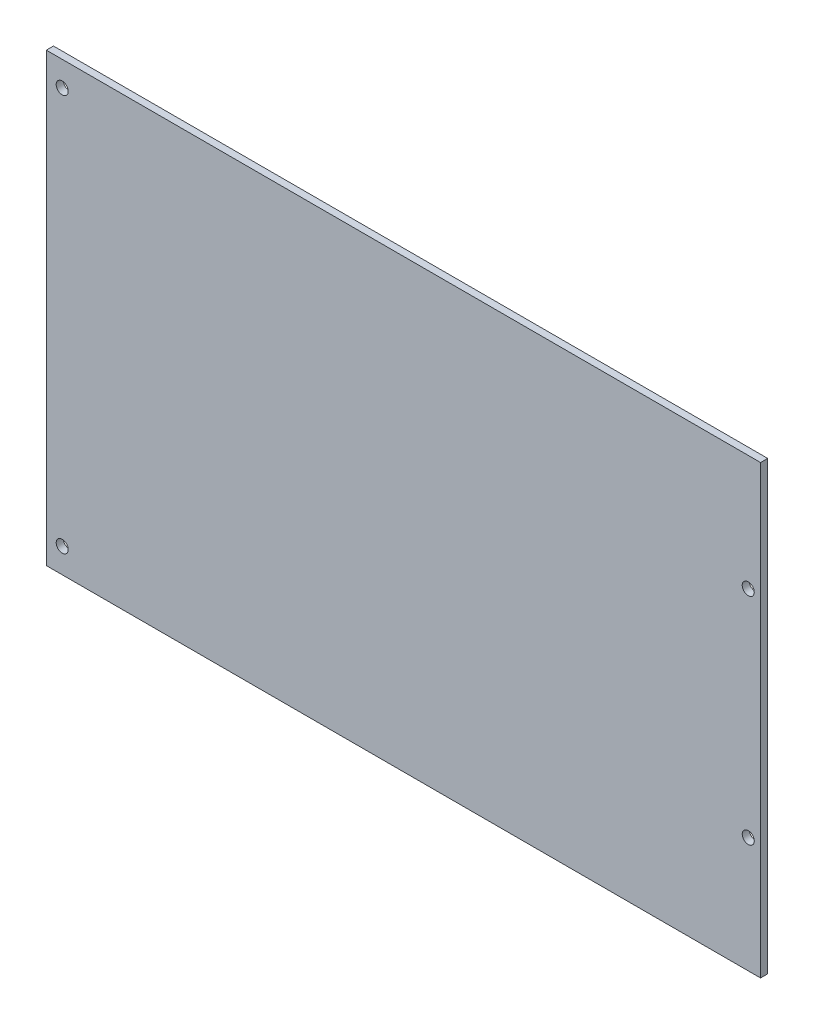
ISO-10303-21;
HEADER;
FILE_DESCRIPTION(('STEP AP214'),'2;1');
FILE_NAME('part.step','',(''),(''),'','','');
FILE_SCHEMA(('AUTOMOTIVE_DESIGN { 1 0 10303 214 1 1 1 1 }'));
ENDSEC;
DATA;
#1=APPLICATION_CONTEXT('core data for automotive mechanical design processes');
#2=APPLICATION_PROTOCOL_DEFINITION('international standard','automotive_design',2000,#1);
#3=PRODUCT_CONTEXT('',#1,'mechanical');
#4=PRODUCT('Part','Part','',(#3));
#5=PRODUCT_RELATED_PRODUCT_CATEGORY('part','',(#4));
#6=PRODUCT_DEFINITION_FORMATION('','',#4);
#7=PRODUCT_DEFINITION_CONTEXT('part definition',#1,'design');
#8=PRODUCT_DEFINITION('design','',#6,#7);
#9=PRODUCT_DEFINITION_SHAPE('','',#8);
#10=(LENGTH_UNIT() NAMED_UNIT(*) SI_UNIT(.MILLI.,.METRE.));
#11=(NAMED_UNIT(*) PLANE_ANGLE_UNIT() SI_UNIT($,.RADIAN.));
#12=(NAMED_UNIT(*) SI_UNIT($,.STERADIAN.) SOLID_ANGLE_UNIT());
#13=UNCERTAINTY_MEASURE_WITH_UNIT(LENGTH_MEASURE(1.E-05),#10,'distance_accuracy_value','');
#14=(GEOMETRIC_REPRESENTATION_CONTEXT(3) GLOBAL_UNCERTAINTY_ASSIGNED_CONTEXT((#13)) GLOBAL_UNIT_ASSIGNED_CONTEXT((#10,
#11,#12)) REPRESENTATION_CONTEXT('',''));
#15=CARTESIAN_POINT('',(0.,0.,0.));
#16=DIRECTION('',(0.,0.,1.));
#17=DIRECTION('',(1.,0.,0.));
#18=AXIS2_PLACEMENT_3D('',#15,#16,#17);
#19=CARTESIAN_POINT('',(80.,50.,1.6));
#20=DIRECTION('',(-1.,0.,0.));
#21=DIRECTION('',(0.,-1.,0.));
#22=AXIS2_PLACEMENT_3D('',#19,#20,#21);
#23=PLANE('',#22);
#24=DIRECTION('',(0.,1.,0.));
#25=VECTOR('',#24,1.);
#26=CARTESIAN_POINT('',(80.,50.,0.));
#27=LINE('',#26,#25);
#28=CARTESIAN_POINT('',(80.,-50.,0.));
#29=VERTEX_POINT('',#28);
#30=CARTESIAN_POINT('',(80.,50.,0.));
#31=VERTEX_POINT('',#30);
#32=EDGE_CURVE('E95',#29,#31,#27,.T.);
#33=ORIENTED_EDGE('',*,*,#32,.T.);
#34=DIRECTION('',(0.,0.,-1.));
#35=VECTOR('',#34,1.);
#36=CARTESIAN_POINT('',(80.,50.,1.6));
#37=LINE('',#36,#35);
#38=CARTESIAN_POINT('',(80.,50.,1.6));
#39=VERTEX_POINT('',#38);
#40=EDGE_CURVE('E11',#39,#31,#37,.T.);
#41=ORIENTED_EDGE('',*,*,#40,.F.);
#42=DIRECTION('',(0.,1.,0.));
#43=VECTOR('',#42,1.);
#44=CARTESIAN_POINT('',(80.,50.,1.6));
#45=LINE('',#44,#43);
#46=CARTESIAN_POINT('',(80.,-50.,1.6));
#47=VERTEX_POINT('',#46);
#48=EDGE_CURVE('E83',#47,#39,#45,.T.);
#49=ORIENTED_EDGE('',*,*,#48,.F.);
#50=DIRECTION('',(0.,0.,-1.));
#51=VECTOR('',#50,1.);
#52=CARTESIAN_POINT('',(80.,-50.,1.6));
#53=LINE('',#52,#51);
#54=EDGE_CURVE('E91',#47,#29,#53,.T.);
#55=ORIENTED_EDGE('',*,*,#54,.T.);
#56=EDGE_LOOP('',(#33,#41,#49,#55));
#57=FACE_BOUND('',#56,.T.);
#58=ADVANCED_FACE('F32',(#57),#23,.F.);
#59=CARTESIAN_POINT('',(-80.,50.,1.6));
#60=DIRECTION('',(0.,-1.,0.));
#61=DIRECTION('',(0.,0.,-1.));
#62=AXIS2_PLACEMENT_3D('',#59,#60,#61);
#63=PLANE('',#62);
#64=DIRECTION('',(-1.,0.,0.));
#65=VECTOR('',#64,1.);
#66=CARTESIAN_POINT('',(-80.,50.,0.));
#67=LINE('',#66,#65);
#68=CARTESIAN_POINT('',(-80.,50.,0.));
#69=VERTEX_POINT('',#68);
#70=EDGE_CURVE('E87',#31,#69,#67,.T.);
#71=ORIENTED_EDGE('',*,*,#70,.T.);
#72=DIRECTION('',(0.,0.,-1.));
#73=VECTOR('',#72,1.);
#74=CARTESIAN_POINT('',(-80.,50.,1.6));
#75=LINE('',#74,#73);
#76=CARTESIAN_POINT('',(-80.,50.,1.6));
#77=VERTEX_POINT('',#76);
#78=EDGE_CURVE('E40',#77,#69,#75,.T.);
#79=ORIENTED_EDGE('',*,*,#78,.F.);
#80=DIRECTION('',(-1.,0.,0.));
#81=VECTOR('',#80,1.);
#82=CARTESIAN_POINT('',(-80.,50.,1.6));
#83=LINE('',#82,#81);
#84=EDGE_CURVE('E78',#39,#77,#83,.T.);
#85=ORIENTED_EDGE('',*,*,#84,.F.);
#86=ORIENTED_EDGE('',*,*,#40,.T.);
#87=EDGE_LOOP('',(#71,#79,#85,#86));
#88=FACE_BOUND('',#87,.T.);
#89=ADVANCED_FACE('F86',(#88),#63,.F.);
#90=CARTESIAN_POINT('',(-80.,50.,1.6));
#91=DIRECTION('',(1.,0.,0.));
#92=DIRECTION('',(0.,1.,0.));
#93=AXIS2_PLACEMENT_3D('',#90,#91,#92);
#94=PLANE('',#93);
#95=DIRECTION('',(0.,-1.,0.));
#96=VECTOR('',#95,1.);
#97=CARTESIAN_POINT('',(-80.,50.,0.));
#98=LINE('',#97,#96);
#99=CARTESIAN_POINT('',(-80.,-50.,0.));
#100=VERTEX_POINT('',#99);
#101=EDGE_CURVE('E65',#69,#100,#98,.T.);
#102=ORIENTED_EDGE('',*,*,#101,.T.);
#103=DIRECTION('',(0.,0.,-1.));
#104=VECTOR('',#103,1.);
#105=CARTESIAN_POINT('',(-80.,-50.,1.6));
#106=LINE('',#105,#104);
#107=CARTESIAN_POINT('',(-80.,-50.,1.6));
#108=VERTEX_POINT('',#107);
#109=EDGE_CURVE('E88',#108,#100,#106,.T.);
#110=ORIENTED_EDGE('',*,*,#109,.F.);
#111=DIRECTION('',(0.,-1.,0.));
#112=VECTOR('',#111,1.);
#113=CARTESIAN_POINT('',(-80.,50.,1.6));
#114=LINE('',#113,#112);
#115=EDGE_CURVE('E81',#77,#108,#114,.T.);
#116=ORIENTED_EDGE('',*,*,#115,.F.);
#117=ORIENTED_EDGE('',*,*,#78,.T.);
#118=EDGE_LOOP('',(#102,#110,#116,#117));
#119=FACE_BOUND('',#118,.T.);
#120=ADVANCED_FACE('F89',(#119),#94,.F.);
#121=CARTESIAN_POINT('',(-80.,-50.,1.6));
#122=DIRECTION('',(0.,1.,0.));
#123=DIRECTION('',(0.,0.,1.));
#124=AXIS2_PLACEMENT_3D('',#121,#122,#123);
#125=PLANE('',#124);
#126=DIRECTION('',(1.,0.,0.));
#127=VECTOR('',#126,1.);
#128=CARTESIAN_POINT('',(-80.,-50.,0.));
#129=LINE('',#128,#127);
#130=EDGE_CURVE('E71',#100,#29,#129,.T.);
#131=ORIENTED_EDGE('',*,*,#130,.T.);
#132=ORIENTED_EDGE('',*,*,#54,.F.);
#133=DIRECTION('',(1.,0.,0.));
#134=VECTOR('',#133,1.);
#135=CARTESIAN_POINT('',(-80.,-50.,1.6));
#136=LINE('',#135,#134);
#137=EDGE_CURVE('E48',#108,#47,#136,.T.);
#138=ORIENTED_EDGE('',*,*,#137,.F.);
#139=ORIENTED_EDGE('',*,*,#109,.T.);
#140=EDGE_LOOP('',(#131,#132,#138,#139));
#141=FACE_BOUND('',#140,.T.);
#142=ADVANCED_FACE('F103',(#141),#125,.F.);
#143=CARTESIAN_POINT('',(80.,-50.,1.6));
#144=DIRECTION('',(0.,0.,1.));
#145=DIRECTION('',(1.,0.,0.));
#146=AXIS2_PLACEMENT_3D('',#143,#144,#145);
#147=PLANE('',#146);
#148=CARTESIAN_POINT('',(77.24,24.13,1.6));
#149=DIRECTION('',(0.,0.,1.));
#150=DIRECTION('',(1.,0.,0.));
#151=AXIS2_PLACEMENT_3D('',#148,#149,#150);
#152=CIRCLE('',#151,1.35);
#153=CARTESIAN_POINT('',(78.59,24.13,1.6));
#154=VERTEX_POINT('',#153);
#155=EDGE_CURVE('E129',#154,#154,#152,.T.);
#156=ORIENTED_EDGE('',*,*,#155,.F.);
#157=EDGE_LOOP('',(#156));
#158=FACE_BOUND('',#157,.T.);
#159=CARTESIAN_POINT('',(77.24,-24.13,1.6));
#160=DIRECTION('',(0.,0.,1.));
#161=DIRECTION('',(1.,0.,0.));
#162=AXIS2_PLACEMENT_3D('',#159,#160,#161);
#163=CIRCLE('',#162,1.35);
#164=CARTESIAN_POINT('',(78.59,-24.13,1.6));
#165=VERTEX_POINT('',#164);
#166=EDGE_CURVE('E123',#165,#165,#163,.T.);
#167=ORIENTED_EDGE('',*,*,#166,.F.);
#168=EDGE_LOOP('',(#167));
#169=FACE_BOUND('',#168,.T.);
#170=CARTESIAN_POINT('',(-76.43,44.45,1.6));
#171=DIRECTION('',(0.,0.,1.));
#172=DIRECTION('',(1.,0.,0.));
#173=AXIS2_PLACEMENT_3D('',#170,#171,#172);
#174=CIRCLE('',#173,1.35);
#175=CARTESIAN_POINT('',(-75.08,44.45,1.6));
#176=VERTEX_POINT('',#175);
#177=EDGE_CURVE('E117',#176,#176,#174,.T.);
#178=ORIENTED_EDGE('',*,*,#177,.F.);
#179=EDGE_LOOP('',(#178));
#180=FACE_BOUND('',#179,.T.);
#181=CARTESIAN_POINT('',(-76.43,-44.45,1.6));
#182=DIRECTION('',(0.,0.,1.));
#183=DIRECTION('',(1.,0.,0.));
#184=AXIS2_PLACEMENT_3D('',#181,#182,#183);
#185=CIRCLE('',#184,1.35);
#186=CARTESIAN_POINT('',(-75.08,-44.45,1.6));
#187=VERTEX_POINT('',#186);
#188=EDGE_CURVE('E111',#187,#187,#185,.T.);
#189=ORIENTED_EDGE('',*,*,#188,.F.);
#190=EDGE_LOOP('',(#189));
#191=FACE_BOUND('',#190,.T.);
#192=ORIENTED_EDGE('',*,*,#48,.T.);
#193=ORIENTED_EDGE('',*,*,#84,.T.);
#194=ORIENTED_EDGE('',*,*,#115,.T.);
#195=ORIENTED_EDGE('',*,*,#137,.T.);
#196=EDGE_LOOP('',(#192,#193,#194,#195));
#197=FACE_BOUND('',#196,.T.);
#198=ADVANCED_FACE('F79',(#158,#169,#180,#191,#197),#147,.T.);
#199=CARTESIAN_POINT('',(80.,-50.,0.));
#200=DIRECTION('',(0.,0.,1.));
#201=DIRECTION('',(1.,0.,0.));
#202=AXIS2_PLACEMENT_3D('',#199,#200,#201);
#203=PLANE('',#202);
#204=CARTESIAN_POINT('',(77.24,24.13,0.));
#205=DIRECTION('',(0.,0.,1.));
#206=DIRECTION('',(1.,0.,0.));
#207=AXIS2_PLACEMENT_3D('',#204,#205,#206);
#208=CIRCLE('',#207,1.35);
#209=CARTESIAN_POINT('',(78.59,24.13,0.));
#210=VERTEX_POINT('',#209);
#211=EDGE_CURVE('E126',#210,#210,#208,.T.);
#212=ORIENTED_EDGE('',*,*,#211,.T.);
#213=EDGE_LOOP('',(#212));
#214=FACE_BOUND('',#213,.T.);
#215=CARTESIAN_POINT('',(77.24,-24.13,0.));
#216=DIRECTION('',(0.,0.,1.));
#217=DIRECTION('',(1.,0.,0.));
#218=AXIS2_PLACEMENT_3D('',#215,#216,#217);
#219=CIRCLE('',#218,1.35);
#220=CARTESIAN_POINT('',(78.59,-24.13,0.));
#221=VERTEX_POINT('',#220);
#222=EDGE_CURVE('E120',#221,#221,#219,.T.);
#223=ORIENTED_EDGE('',*,*,#222,.T.);
#224=EDGE_LOOP('',(#223));
#225=FACE_BOUND('',#224,.T.);
#226=CARTESIAN_POINT('',(-76.43,44.45,0.));
#227=DIRECTION('',(0.,0.,1.));
#228=DIRECTION('',(1.,0.,0.));
#229=AXIS2_PLACEMENT_3D('',#226,#227,#228);
#230=CIRCLE('',#229,1.35);
#231=CARTESIAN_POINT('',(-75.08,44.45,0.));
#232=VERTEX_POINT('',#231);
#233=EDGE_CURVE('E114',#232,#232,#230,.T.);
#234=ORIENTED_EDGE('',*,*,#233,.T.);
#235=EDGE_LOOP('',(#234));
#236=FACE_BOUND('',#235,.T.);
#237=CARTESIAN_POINT('',(-76.43,-44.45,0.));
#238=DIRECTION('',(0.,0.,1.));
#239=DIRECTION('',(1.,0.,0.));
#240=AXIS2_PLACEMENT_3D('',#237,#238,#239);
#241=CIRCLE('',#240,1.35);
#242=CARTESIAN_POINT('',(-75.08,-44.45,0.));
#243=VERTEX_POINT('',#242);
#244=EDGE_CURVE('E98',#243,#243,#241,.T.);
#245=ORIENTED_EDGE('',*,*,#244,.T.);
#246=EDGE_LOOP('',(#245));
#247=FACE_BOUND('',#246,.T.);
#248=ORIENTED_EDGE('',*,*,#32,.F.);
#249=ORIENTED_EDGE('',*,*,#130,.F.);
#250=ORIENTED_EDGE('',*,*,#101,.F.);
#251=ORIENTED_EDGE('',*,*,#70,.F.);
#252=EDGE_LOOP('',(#248,#249,#250,#251));
#253=FACE_BOUND('',#252,.T.);
#254=ADVANCED_FACE('F106',(#214,#225,#236,#247,#253),#203,.F.);
#255=CARTESIAN_POINT('',(-76.43,-44.45,1.6));
#256=DIRECTION('',(0.,0.,1.));
#257=DIRECTION('',(1.,0.,0.));
#258=AXIS2_PLACEMENT_3D('',#255,#256,#257);
#259=CYLINDRICAL_SURFACE('',#258,1.35);
#260=ORIENTED_EDGE('',*,*,#244,.F.);
#261=EDGE_LOOP('',(#260));
#262=FACE_BOUND('',#261,.T.);
#263=ORIENTED_EDGE('',*,*,#188,.T.);
#264=EDGE_LOOP('',(#263));
#265=FACE_BOUND('',#264,.T.);
#266=ADVANCED_FACE('F144',(#262,#265),#259,.F.);
#267=CARTESIAN_POINT('',(-76.43,44.45,1.6));
#268=DIRECTION('',(0.,0.,1.));
#269=DIRECTION('',(1.,0.,0.));
#270=AXIS2_PLACEMENT_3D('',#267,#268,#269);
#271=CYLINDRICAL_SURFACE('',#270,1.35);
#272=ORIENTED_EDGE('',*,*,#233,.F.);
#273=EDGE_LOOP('',(#272));
#274=FACE_BOUND('',#273,.T.);
#275=ORIENTED_EDGE('',*,*,#177,.T.);
#276=EDGE_LOOP('',(#275));
#277=FACE_BOUND('',#276,.T.);
#278=ADVANCED_FACE('F146',(#274,#277),#271,.F.);
#279=CARTESIAN_POINT('',(77.24,-24.13,1.6));
#280=DIRECTION('',(0.,0.,1.));
#281=DIRECTION('',(1.,0.,0.));
#282=AXIS2_PLACEMENT_3D('',#279,#280,#281);
#283=CYLINDRICAL_SURFACE('',#282,1.35);
#284=ORIENTED_EDGE('',*,*,#222,.F.);
#285=EDGE_LOOP('',(#284));
#286=FACE_BOUND('',#285,.T.);
#287=ORIENTED_EDGE('',*,*,#166,.T.);
#288=EDGE_LOOP('',(#287));
#289=FACE_BOUND('',#288,.T.);
#290=ADVANCED_FACE('F153',(#286,#289),#283,.F.);
#291=CARTESIAN_POINT('',(77.24,24.13,1.6));
#292=DIRECTION('',(0.,0.,1.));
#293=DIRECTION('',(1.,0.,0.));
#294=AXIS2_PLACEMENT_3D('',#291,#292,#293);
#295=CYLINDRICAL_SURFACE('',#294,1.35);
#296=ORIENTED_EDGE('',*,*,#211,.F.);
#297=EDGE_LOOP('',(#296));
#298=FACE_BOUND('',#297,.T.);
#299=ORIENTED_EDGE('',*,*,#155,.T.);
#300=EDGE_LOOP('',(#299));
#301=FACE_BOUND('',#300,.T.);
#302=ADVANCED_FACE('F133',(#298,#301),#295,.F.);
#303=CLOSED_SHELL('',(#58,#89,#120,#142,#198,#254,#266,#278,#290,#302));
#304=MANIFOLD_SOLID_BREP('B2',#303);
#305=ADVANCED_BREP_SHAPE_REPRESENTATION('',(#18,#304),#14);
#306=SHAPE_DEFINITION_REPRESENTATION(#9,#305);
ENDSEC;
END-ISO-10303-21;
